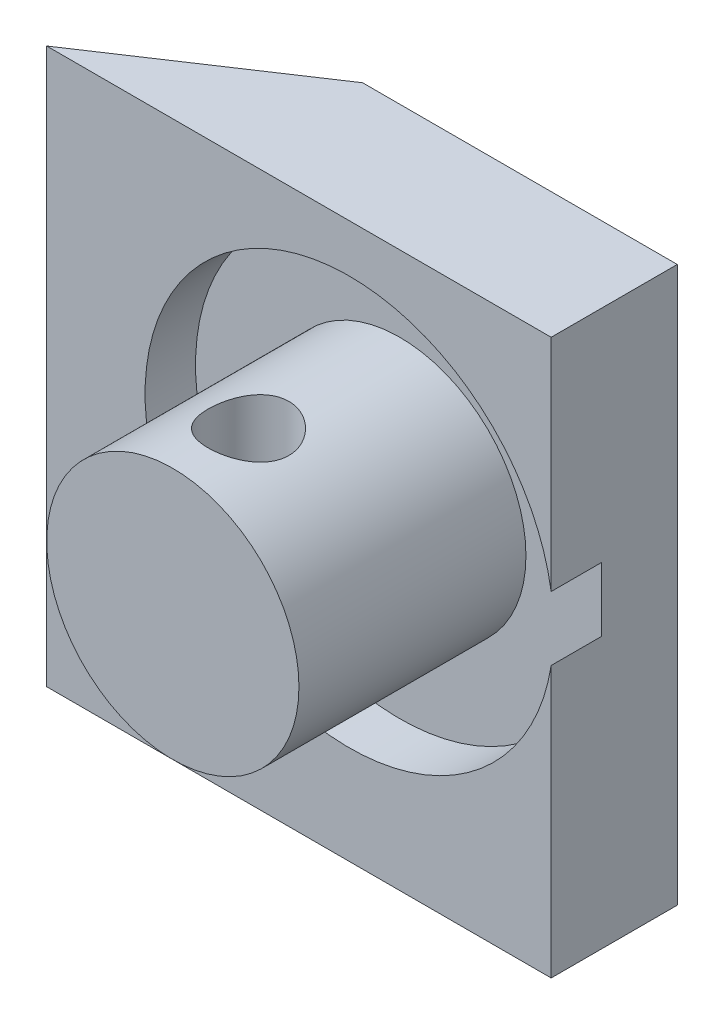
ISO-10303-21;
HEADER;
FILE_DESCRIPTION(('STEP AP214'),'2;1');
FILE_NAME('part.step','',(''),(''),'','','');
FILE_SCHEMA(('AUTOMOTIVE_DESIGN { 1 0 10303 214 1 1 1 1 }'));
ENDSEC;
DATA;
#1=APPLICATION_CONTEXT('core data for automotive mechanical design processes');
#2=APPLICATION_PROTOCOL_DEFINITION('international standard','automotive_design',2000,#1);
#3=PRODUCT_CONTEXT('',#1,'mechanical');
#4=PRODUCT('Part','Part','',(#3));
#5=PRODUCT_RELATED_PRODUCT_CATEGORY('part','',(#4));
#6=PRODUCT_DEFINITION_FORMATION('','',#4);
#7=PRODUCT_DEFINITION_CONTEXT('part definition',#1,'design');
#8=PRODUCT_DEFINITION('design','',#6,#7);
#9=PRODUCT_DEFINITION_SHAPE('','',#8);
#10=(LENGTH_UNIT() NAMED_UNIT(*) SI_UNIT(.MILLI.,.METRE.));
#11=(NAMED_UNIT(*) PLANE_ANGLE_UNIT() SI_UNIT($,.RADIAN.));
#12=(NAMED_UNIT(*) SI_UNIT($,.STERADIAN.) SOLID_ANGLE_UNIT());
#13=UNCERTAINTY_MEASURE_WITH_UNIT(LENGTH_MEASURE(1.E-05),#10,'distance_accuracy_value','');
#14=(GEOMETRIC_REPRESENTATION_CONTEXT(3) GLOBAL_UNCERTAINTY_ASSIGNED_CONTEXT((#13)) GLOBAL_UNIT_ASSIGNED_CONTEXT((#10,
#11,#12)) REPRESENTATION_CONTEXT('',''));
#15=CARTESIAN_POINT('',(0.,0.,0.));
#16=DIRECTION('',(0.,0.,1.));
#17=DIRECTION('',(1.,0.,0.));
#18=AXIS2_PLACEMENT_3D('',#15,#16,#17);
#19=CARTESIAN_POINT('',(-8.,12.,7.));
#20=DIRECTION('',(0.,0.,-1.));
#21=DIRECTION('',(-1.,0.,0.));
#22=AXIS2_PLACEMENT_3D('',#19,#20,#21);
#23=CYLINDRICAL_SURFACE('',#22,5.);
#24=CARTESIAN_POINT('',(-8.,12.,7.));
#25=DIRECTION('',(0.,0.,1.));
#26=DIRECTION('',(1.,0.,0.));
#27=AXIS2_PLACEMENT_3D('',#24,#25,#26);
#28=CIRCLE('',#27,5.);
#29=CARTESIAN_POINT('',(-3.,12.,7.));
#30=VERTEX_POINT('',#29);
#31=EDGE_CURVE('E120',#30,#30,#28,.T.);
#32=ORIENTED_EDGE('',*,*,#31,.F.);
#33=EDGE_LOOP('',(#32));
#34=FACE_BOUND('',#33,.T.);
#35=CARTESIAN_POINT('',(-8.,12.,-2.));
#36=DIRECTION('',(0.,0.,1.));
#37=DIRECTION('',(1.,0.,0.));
#38=AXIS2_PLACEMENT_3D('',#35,#36,#37);
#39=CIRCLE('',#38,5.);
#40=CARTESIAN_POINT('',(-3.,12.,-2.));
#41=VERTEX_POINT('',#40);
#42=EDGE_CURVE('E116',#41,#41,#39,.T.);
#43=ORIENTED_EDGE('',*,*,#42,.T.);
#44=EDGE_LOOP('',(#43));
#45=FACE_BOUND('',#44,.T.);
#46=CARTESIAN_POINT('',(-8.,6.99999999999999,2.4));
#47=CARTESIAN_POINT('',(-7.91250419368402,7.00000021456373,2.40000024365058));
#48=CARTESIAN_POINT('',(-7.82500536294094,7.00231815843644,2.40720059527926));
#49=CARTESIAN_POINT('',(-7.65257309876252,7.01133737827773,2.43573181952926));
#50=CARTESIAN_POINT('',(-7.56764013662629,7.01803945446441,2.45706527181791));
#51=CARTESIAN_POINT('',(-7.40285077420844,7.0350961636459,2.51306492121177));
#52=CARTESIAN_POINT('',(-7.3229865266154,7.04544497954808,2.5477098923706));
#53=CARTESIAN_POINT('',(-7.17020123714884,7.06873098357127,2.62925683008726));
#54=CARTESIAN_POINT('',(-7.09728139297505,7.08166861699614,2.67616090576561));
#55=CARTESIAN_POINT('',(-6.95810524220502,7.10922932066174,2.78248411350403));
#56=CARTESIAN_POINT('',(-6.8921039077536,7.12389042267082,2.84222709895342));
#57=CARTESIAN_POINT('',(-6.77086576306772,7.15302934296929,2.97184306654741));
#58=CARTESIAN_POINT('',(-6.71563108206203,7.16750712447671,3.04171804765487));
#59=CARTESIAN_POINT('',(-6.61608604926169,7.1950518920097,3.19185285451039));
#60=CARTESIAN_POINT('',(-6.57209876890056,7.20807214364582,3.27233628127054));
#61=CARTESIAN_POINT('',(-6.4983908286541,7.23065342201354,3.44004234377011));
#62=CARTESIAN_POINT('',(-6.46866620226674,7.24021541031984,3.52726309798831));
#63=CARTESIAN_POINT('',(-6.42526865688679,7.25439877239402,3.70308260727288));
#64=CARTESIAN_POINT('',(-6.41112103153615,7.25916585067255,3.79155210175203));
#65=CARTESIAN_POINT('',(-6.39779566941149,7.26365168955,3.96972759918446));
#66=CARTESIAN_POINT('',(-6.3986137290628,7.26337186772693,4.05943324785197));
#67=CARTESIAN_POINT('',(-6.41482619263619,7.25792380899924,4.23356558488824));
#68=CARTESIAN_POINT('',(-6.42961157867275,7.2529598256958,4.3180564534447));
#69=CARTESIAN_POINT('',(-6.47234941025861,7.23903542553838,4.48328884442206));
#70=CARTESIAN_POINT('',(-6.50030331730673,7.23007456509974,4.5640299495852));
#71=CARTESIAN_POINT('',(-6.56900354841188,7.2090134583636,4.72089785882574));
#72=CARTESIAN_POINT('',(-6.60993726896277,7.19686770530637,4.79693621995147));
#73=CARTESIAN_POINT('',(-6.70330505665932,7.17082555138832,4.94126204302677));
#74=CARTESIAN_POINT('',(-6.75574223172845,7.15692867785459,5.00954740274354));
#75=CARTESIAN_POINT('',(-6.87359448459613,7.12813627858128,5.13986467286628));
#76=CARTESIAN_POINT('',(-6.93951063750598,7.11322479191819,5.20144077693881));
#77=CARTESIAN_POINT('',(-7.08091856778285,7.08466831885122,5.31277867823365));
#78=CARTESIAN_POINT('',(-7.1564111243473,7.07102343566293,5.36253951314289));
#79=CARTESIAN_POINT('',(-7.31573841928763,7.04638210255415,5.44916344328023));
#80=CARTESIAN_POINT('',(-7.39963872055936,7.03540919452058,5.48591310083643));
#81=CARTESIAN_POINT('',(-7.57286414963887,7.01751838899803,5.54463959666271));
#82=CARTESIAN_POINT('',(-7.66218753686845,7.01059919795363,5.56662114781672));
#83=CARTESIAN_POINT('',(-7.83985821041068,7.00180575760865,5.59440006666522));
#84=CARTESIAN_POINT('',(-7.92809971398293,6.99973939821845,5.6008140736111));
#85=CARTESIAN_POINT('',(-8.10441026958811,7.00031344681555,5.5990207817787));
#86=CARTESIAN_POINT('',(-8.19247934608744,7.00295312995793,5.59081573469012));
#87=CARTESIAN_POINT('',(-8.36353501820381,7.01251619682503,5.56050988691883));
#88=CARTESIAN_POINT('',(-8.44659436247802,7.01932513350734,5.5387800899141));
#89=CARTESIAN_POINT('',(-8.60786165460058,7.03642414004651,5.48249820060375));
#90=CARTESIAN_POINT('',(-8.68606899379412,7.04671464560453,5.44794450339782));
#91=CARTESIAN_POINT('',(-8.83759692387044,7.07004468980095,5.36602898282185));
#92=CARTESIAN_POINT('',(-8.91074562050097,7.08314673729909,5.3183674880577));
#93=CARTESIAN_POINT('',(-9.04821150300662,7.1106059175952,5.21194612701436));
#94=CARTESIAN_POINT('',(-9.11252617555398,7.12496340567921,5.1531831135417));
#95=CARTESIAN_POINT('',(-9.23328321488635,7.15407032716762,5.02332584038904));
#96=CARTESIAN_POINT('',(-9.28928579475621,7.16881115833265,4.95181973231152));
#97=CARTESIAN_POINT('',(-9.3885414199257,7.19639556889855,4.80010532554179));
#98=CARTESIAN_POINT('',(-9.43179457025642,7.20923916392861,4.71989709854595));
#99=CARTESIAN_POINT('',(-9.50407580301231,7.23143737113424,4.55315642134392));
#100=CARTESIAN_POINT('',(-9.53315066307446,7.24080343179948,4.46664586501031));
#101=CARTESIAN_POINT('',(-9.57620668246201,7.25488718300672,4.28959279018967));
#102=CARTESIAN_POINT('',(-9.59019395006567,7.25960675463266,4.19905191886401));
#103=CARTESIAN_POINT('',(-9.60222535311566,7.26366072101231,4.02112403083601));
#104=CARTESIAN_POINT('',(-9.60099388446006,7.26323980908617,3.93379098867101));
#105=CARTESIAN_POINT('',(-9.5843835514937,7.25765840906254,3.7606429945653));
#106=CARTESIAN_POINT('',(-9.56900540861121,7.25249816265368,3.67482796543897));
#107=CARTESIAN_POINT('',(-9.52503332416461,7.23819456855584,3.50851657462312));
#108=CARTESIAN_POINT('',(-9.49665627942706,7.22911672763237,3.42795680110713));
#109=CARTESIAN_POINT('',(-9.42766427484382,7.20802024405638,3.27267823959919));
#110=CARTESIAN_POINT('',(-9.38704674114626,7.1960009830008,3.1979606842373));
#111=CARTESIAN_POINT('',(-9.29279266707432,7.16976505631623,3.05319037018559));
#112=CARTESIAN_POINT('',(-9.23869308431578,7.15547880947319,2.98345173726596));
#113=CARTESIAN_POINT('',(-9.11981399792884,7.12662819152646,2.85380825417904));
#114=CARTESIAN_POINT('',(-9.05503158166823,7.11206374553304,2.79390609480135));
#115=CARTESIAN_POINT('',(-8.91391221029835,7.08368891799883,2.68354171407617));
#116=CARTESIAN_POINT('',(-8.83725135176078,7.06992248119614,2.63348104811569));
#117=CARTESIAN_POINT('',(-8.67616352992694,7.04526212302139,2.54701981190277));
#118=CARTESIAN_POINT('',(-8.59173926320816,7.03436720928706,2.51061452067921));
#119=CARTESIAN_POINT('',(-8.42366343164485,7.01731658935934,2.45475222016956));
#120=CARTESIAN_POINT('',(-8.34037676648733,7.01088098698549,2.43428154941689));
#121=CARTESIAN_POINT('',(-8.17139400107612,7.00222306458606,2.40690685709599));
#122=CARTESIAN_POINT('',(-8.0856984512614,6.99999978984387,2.39999976135453));
#123=CARTESIAN_POINT('',(-8.,6.99999999999999,2.4));
#124=B_SPLINE_CURVE_WITH_KNOTS('',3,(#46,#47,#48,#49,#50,#51,#52,#53,#54,#55,#56,#57,#58,#59,
#60,#61,#62,#63,#64,#65,#66,#67,#68,#69,#70,#71,#72,#73,#74,#75,#76,#77,#78,#79,#80,#81,#82,#83,
#84,#85,#86,#87,#88,#89,#90,#91,#92,#93,#94,#95,#96,#97,#98,#99,#100,#101,#102,#103,#104,#105,
#106,#107,#108,#109,#110,#111,#112,#113,#114,#115,#116,#117,#118,#119,#120,#121,#122,#123),
.UNSPECIFIED.,.T.,.F.,(4,2,2,2,2,2,2,2,2,2,2,2,2,2,2,2,2,2,2,2,2,2,2,2,2,2,2,2,2,2,2,2,2,2,2,2,
2,2,4),(0.,0.262172289866487,0.524392446348364,0.786196202111712,1.04804502964703,
1.31749718151567,1.58700256668426,1.86354828826627,2.14001705671955,2.40780489999506,
2.67551752794223,2.93207089351445,3.18865273918778,3.44912195934763,3.70966163813009,
3.98267284808623,4.25570628624555,4.53106471334195,4.80633522466348,5.07051010591345,
5.33464430132699,5.59183416387789,5.84905622438333,6.11273355055081,6.37648573964818,
6.6512299305306,6.92597185797942,7.19980110675104,7.47351945288796,7.73426134972847,
7.99498995042988,8.25151822881316,8.50810048600705,8.77513756675923,9.04224757485583,
9.3186628553126,9.5949824844973,9.85182740305347,10.1086141011962),.UNSPECIFIED.);
#125=CARTESIAN_POINT('',(-8.,6.99999999999999,2.4));
#126=VERTEX_POINT('',#125);
#127=EDGE_CURVE('E145',#126,#126,#124,.T.);
#128=ORIENTED_EDGE('',*,*,#127,.F.);
#129=EDGE_LOOP('',(#128));
#130=FACE_BOUND('',#129,.T.);
#131=CARTESIAN_POINT('',(-8.,17.,2.4));
#132=CARTESIAN_POINT('',(-8.08749580631598,16.9999997854363,2.40000024365058));
#133=CARTESIAN_POINT('',(-8.17499463705906,16.9976818415636,2.40720059527926));
#134=CARTESIAN_POINT('',(-8.34742690123748,16.9886626217223,2.43573181952926));
#135=CARTESIAN_POINT('',(-8.43235986337371,16.9819605455356,2.45706527181791));
#136=CARTESIAN_POINT('',(-8.59714922579156,16.9649038363541,2.51306492121177));
#137=CARTESIAN_POINT('',(-8.67701347338459,16.9545550204519,2.5477098923706));
#138=CARTESIAN_POINT('',(-8.82979876285116,16.9312690164287,2.62925683008726));
#139=CARTESIAN_POINT('',(-8.90271860702495,16.9183313830039,2.67616090576561));
#140=CARTESIAN_POINT('',(-9.04189475779498,16.8907706793383,2.78248411350403));
#141=CARTESIAN_POINT('',(-9.1078960922464,16.8761095773292,2.84222709895342));
#142=CARTESIAN_POINT('',(-9.22913423693228,16.8469706570307,2.97184306654741));
#143=CARTESIAN_POINT('',(-9.28436891793797,16.8324928755233,3.04171804765487));
#144=CARTESIAN_POINT('',(-9.38391395073831,16.8049481079903,3.19185285451038));
#145=CARTESIAN_POINT('',(-9.42790123109944,16.7919278563542,3.27233628127054));
#146=CARTESIAN_POINT('',(-9.5016091713459,16.7693465779865,3.44004234377011));
#147=CARTESIAN_POINT('',(-9.53133379773326,16.7597845896802,3.52726309798831));
#148=CARTESIAN_POINT('',(-9.57473134311321,16.745601227606,3.70308260727288));
#149=CARTESIAN_POINT('',(-9.58887896846386,16.7408341493274,3.79155210175203));
#150=CARTESIAN_POINT('',(-9.60220433058851,16.73634831045,3.96972759918446));
#151=CARTESIAN_POINT('',(-9.6013862709372,16.7366281322731,4.05943324785197));
#152=CARTESIAN_POINT('',(-9.58517380736381,16.7420761910008,4.23356558488824));
#153=CARTESIAN_POINT('',(-9.57038842132725,16.7470401743042,4.3180564534447));
#154=CARTESIAN_POINT('',(-9.52765058974139,16.7609645744616,4.48328884442206));
#155=CARTESIAN_POINT('',(-9.49969668269327,16.7699254349003,4.5640299495852));
#156=CARTESIAN_POINT('',(-9.43099645158812,16.7909865416364,4.72089785882574));
#157=CARTESIAN_POINT('',(-9.39006273103723,16.8031322946936,4.79693621995147));
#158=CARTESIAN_POINT('',(-9.29669494334068,16.8291744486117,4.94126204302677));
#159=CARTESIAN_POINT('',(-9.24425776827155,16.8430713221454,5.00954740274354));
#160=CARTESIAN_POINT('',(-9.12640551540387,16.8718637214187,5.13986467286628));
#161=CARTESIAN_POINT('',(-9.06048936249402,16.8867752080818,5.20144077693881));
#162=CARTESIAN_POINT('',(-8.91908143221715,16.9153316811488,5.31277867823365));
#163=CARTESIAN_POINT('',(-8.8435888756527,16.9289765643371,5.36253951314289));
#164=CARTESIAN_POINT('',(-8.68426158071238,16.9536178974458,5.44916344328022));
#165=CARTESIAN_POINT('',(-8.60036127944064,16.9645908054794,5.48591310083643));
#166=CARTESIAN_POINT('',(-8.42713585036113,16.982481611002,5.54463959666271));
#167=CARTESIAN_POINT('',(-8.33781246313155,16.9894008020464,5.56662114781672));
#168=CARTESIAN_POINT('',(-8.16014178958932,16.9981942423913,5.59440006666522));
#169=CARTESIAN_POINT('',(-8.07190028601707,17.0002606017815,5.6008140736111));
#170=CARTESIAN_POINT('',(-7.89558973041189,16.9996865531844,5.5990207817787));
#171=CARTESIAN_POINT('',(-7.80752065391256,16.9970468700421,5.59081573469012));
#172=CARTESIAN_POINT('',(-7.63646498179619,16.987483803175,5.56050988691883));
#173=CARTESIAN_POINT('',(-7.55340563752198,16.9806748664927,5.5387800899141));
#174=CARTESIAN_POINT('',(-7.39213834539942,16.9635758599535,5.48249820060375));
#175=CARTESIAN_POINT('',(-7.31393100620588,16.9532853543955,5.44794450339782));
#176=CARTESIAN_POINT('',(-7.16240307612956,16.9299553101991,5.36602898282185));
#177=CARTESIAN_POINT('',(-7.08925437949904,16.9168532627009,5.3183674880577));
#178=CARTESIAN_POINT('',(-6.95178849699338,16.8893940824048,5.21194612701437));
#179=CARTESIAN_POINT('',(-6.88747382444602,16.8750365943208,5.1531831135417));
#180=CARTESIAN_POINT('',(-6.76671678511365,16.8459296728324,5.02332584038904));
#181=CARTESIAN_POINT('',(-6.7107142052438,16.8311888416674,4.95181973231152));
#182=CARTESIAN_POINT('',(-6.61145858007431,16.8036044311014,4.80010532554179));
#183=CARTESIAN_POINT('',(-6.56820542974359,16.7907608360714,4.71989709854595));
#184=CARTESIAN_POINT('',(-6.49592419698769,16.7685626288658,4.55315642134392));
#185=CARTESIAN_POINT('',(-6.46684933692554,16.7591965682005,4.46664586501031));
#186=CARTESIAN_POINT('',(-6.42379331753799,16.7451128169933,4.28959279018968));
#187=CARTESIAN_POINT('',(-6.40980604993433,16.7403932453673,4.19905191886402));
#188=CARTESIAN_POINT('',(-6.39777464688434,16.7363392789877,4.02112403083601));
#189=CARTESIAN_POINT('',(-6.39900611553994,16.7367601909138,3.93379098867101));
#190=CARTESIAN_POINT('',(-6.4156164485063,16.7423415909375,3.7606429945653));
#191=CARTESIAN_POINT('',(-6.43099459138879,16.7475018373463,3.67482796543897));
#192=CARTESIAN_POINT('',(-6.47496667583539,16.7618054314442,3.50851657462312));
#193=CARTESIAN_POINT('',(-6.50334372057294,16.7708832723676,3.42795680110713));
#194=CARTESIAN_POINT('',(-6.57233572515618,16.7919797559436,3.27267823959919));
#195=CARTESIAN_POINT('',(-6.61295325885374,16.8039990169992,3.1979606842373));
#196=CARTESIAN_POINT('',(-6.70720733292568,16.8302349436838,3.05319037018559));
#197=CARTESIAN_POINT('',(-6.76130691568421,16.8445211905268,2.98345173726596));
#198=CARTESIAN_POINT('',(-6.88018600207115,16.8733718084735,2.85380825417904));
#199=CARTESIAN_POINT('',(-6.94496841833177,16.887936254467,2.79390609480136));
#200=CARTESIAN_POINT('',(-7.08608778970165,16.9163110820012,2.68354171407617));
#201=CARTESIAN_POINT('',(-7.16274864823922,16.9300775188039,2.63348104811569));
#202=CARTESIAN_POINT('',(-7.32383647007306,16.9547378769786,2.54701981190277));
#203=CARTESIAN_POINT('',(-7.40826073679184,16.9656327907129,2.51061452067921));
#204=CARTESIAN_POINT('',(-7.57633656835515,16.9826834106407,2.45475222016956));
#205=CARTESIAN_POINT('',(-7.65962323351267,16.9891190130145,2.43428154941689));
#206=CARTESIAN_POINT('',(-7.82860599892388,16.9977769354139,2.40690685709599));
#207=CARTESIAN_POINT('',(-7.9143015487386,17.0000002101561,2.39999976135453));
#208=CARTESIAN_POINT('',(-8.,17.,2.4));
#209=B_SPLINE_CURVE_WITH_KNOTS('',3,(#131,#132,#133,#134,#135,#136,#137,#138,#139,#140,#141,
#142,#143,#144,#145,#146,#147,#148,#149,#150,#151,#152,#153,#154,#155,#156,#157,#158,#159,#160,
#161,#162,#163,#164,#165,#166,#167,#168,#169,#170,#171,#172,#173,#174,#175,#176,#177,#178,#179,
#180,#181,#182,#183,#184,#185,#186,#187,#188,#189,#190,#191,#192,#193,#194,#195,#196,#197,#198,
#199,#200,#201,#202,#203,#204,#205,#206,#207,#208),.UNSPECIFIED.,.T.,.F.,(4,2,2,2,2,2,2,2,2,2,2,
2,2,2,2,2,2,2,2,2,2,2,2,2,2,2,2,2,2,2,2,2,2,2,2,2,2,2,4),(0.,0.262172289866488,
0.524392446348363,0.786196202111712,1.04804502964703,1.31749718151567,1.58700256668426,
1.86354828826627,2.14001705671955,2.40780489999506,2.67551752794223,2.93207089351445,
3.18865273918778,3.44912195934763,3.70966163813009,3.98267284808623,4.25570628624555,
4.53106471334194,4.80633522466348,5.07051010591344,5.33464430132699,5.59183416387789,
5.84905622438333,6.11273355055081,6.37648573964818,6.65122993053059,6.92597185797942,
7.19980110675104,7.47351945288796,7.73426134972847,7.99498995042988,8.25151822881316,
8.50810048600704,8.77513756675922,9.04224757485583,9.3186628553126,9.5949824844973,
9.85182740305347,10.1086141011961),.UNSPECIFIED.);
#210=CARTESIAN_POINT('',(-8.,17.,2.4));
#211=VERTEX_POINT('',#210);
#212=EDGE_CURVE('E43',#211,#211,#209,.T.);
#213=ORIENTED_EDGE('',*,*,#212,.F.);
#214=EDGE_LOOP('',(#213));
#215=FACE_BOUND('',#214,.T.);
#216=ADVANCED_FACE('F39',(#34,#45,#130,#215),#23,.T.);
#217=CARTESIAN_POINT('',(0.,22.,-5.));
#218=DIRECTION('',(-1.,0.,0.));
#219=DIRECTION('',(0.,0.,1.));
#220=AXIS2_PLACEMENT_3D('',#217,#218,#219);
#221=PLANE('',#220);
#222=DIRECTION('',(0.,1.,0.));
#223=VECTOR('',#222,1.);
#224=CARTESIAN_POINT('',(0.,22.,-2.));
#225=LINE('',#224,#223);
#226=CARTESIAN_POINT('',(0.,10.731142245955,-2.));
#227=VERTEX_POINT('',#226);
#228=CARTESIAN_POINT('',(0.,13.2688577540449,-2.));
#229=VERTEX_POINT('',#228);
#230=EDGE_CURVE('E11',#227,#229,#225,.T.);
#231=ORIENTED_EDGE('',*,*,#230,.F.);
#232=DIRECTION('',(0.,0.,1.));
#233=VECTOR('',#232,1.);
#234=CARTESIAN_POINT('',(0.,10.731142245955,-2.));
#235=LINE('',#234,#233);
#236=CARTESIAN_POINT('',(0.,10.731142245955,0.));
#237=VERTEX_POINT('',#236);
#238=EDGE_CURVE('E110',#227,#237,#235,.T.);
#239=ORIENTED_EDGE('',*,*,#238,.T.);
#240=DIRECTION('',(0.,-1.,0.));
#241=VECTOR('',#240,1.);
#242=CARTESIAN_POINT('',(0.,22.,0.));
#243=LINE('',#242,#241);
#244=CARTESIAN_POINT('',(0.,0.,0.));
#245=VERTEX_POINT('',#244);
#246=EDGE_CURVE('E93',#237,#245,#243,.T.);
#247=ORIENTED_EDGE('',*,*,#246,.T.);
#248=DIRECTION('',(0.,0.,-1.));
#249=VECTOR('',#248,1.);
#250=CARTESIAN_POINT('',(0.,0.,-5.));
#251=LINE('',#250,#249);
#252=CARTESIAN_POINT('',(0.,0.,-5.));
#253=VERTEX_POINT('',#252);
#254=EDGE_CURVE('E198',#245,#253,#251,.T.);
#255=ORIENTED_EDGE('',*,*,#254,.T.);
#256=DIRECTION('',(0.,-1.,0.));
#257=VECTOR('',#256,1.);
#258=CARTESIAN_POINT('',(0.,22.,-5.));
#259=LINE('',#258,#257);
#260=CARTESIAN_POINT('',(0.,22.,-5.));
#261=VERTEX_POINT('',#260);
#262=EDGE_CURVE('E54',#261,#253,#259,.T.);
#263=ORIENTED_EDGE('',*,*,#262,.F.);
#264=DIRECTION('',(0.,0.,-1.));
#265=VECTOR('',#264,1.);
#266=CARTESIAN_POINT('',(0.,22.,-5.));
#267=LINE('',#266,#265);
#268=CARTESIAN_POINT('',(0.,22.,0.));
#269=VERTEX_POINT('',#268);
#270=EDGE_CURVE('E199',#269,#261,#267,.T.);
#271=ORIENTED_EDGE('',*,*,#270,.F.);
#272=CARTESIAN_POINT('',(0.,13.2688577540449,0.));
#273=VERTEX_POINT('',#272);
#274=EDGE_CURVE('E128',#269,#273,#243,.T.);
#275=ORIENTED_EDGE('',*,*,#274,.T.);
#276=DIRECTION('',(0.,0.,1.));
#277=VECTOR('',#276,1.);
#278=CARTESIAN_POINT('',(0.,13.2688577540449,-2.));
#279=LINE('',#278,#277);
#280=EDGE_CURVE('E62',#273,#229,#279,.F.);
#281=ORIENTED_EDGE('',*,*,#280,.T.);
#282=EDGE_LOOP('',(#231,#239,#247,#255,#263,#271,#275,#281));
#283=FACE_BOUND('',#282,.T.);
#284=ADVANCED_FACE('F41',(#283),#221,.F.);
#285=CARTESIAN_POINT('',(0.,22.,-5.));
#286=DIRECTION('',(0.,0.,1.));
#287=DIRECTION('',(1.,0.,0.));
#288=AXIS2_PLACEMENT_3D('',#285,#286,#287);
#289=PLANE('',#288);
#290=DIRECTION('',(-1.,0.,0.));
#291=VECTOR('',#290,1.);
#292=CARTESIAN_POINT('',(0.,0.,-5.));
#293=LINE('',#292,#291);
#294=CARTESIAN_POINT('',(-12.4774531024531,0.,-5.));
#295=VERTEX_POINT('',#294);
#296=EDGE_CURVE('E208',#253,#295,#293,.T.);
#297=ORIENTED_EDGE('',*,*,#296,.T.);
#298=DIRECTION('',(0.,-1.,0.));
#299=VECTOR('',#298,1.);
#300=CARTESIAN_POINT('',(-12.4774531024531,22.,-5.));
#301=LINE('',#300,#299);
#302=CARTESIAN_POINT('',(-12.4774531024531,22.,-5.));
#303=VERTEX_POINT('',#302);
#304=EDGE_CURVE('E140',#303,#295,#301,.T.);
#305=ORIENTED_EDGE('',*,*,#304,.F.);
#306=DIRECTION('',(-1.,0.,0.));
#307=VECTOR('',#306,1.);
#308=CARTESIAN_POINT('',(0.,22.,-5.));
#309=LINE('',#308,#307);
#310=EDGE_CURVE('E101',#261,#303,#309,.T.);
#311=ORIENTED_EDGE('',*,*,#310,.F.);
#312=ORIENTED_EDGE('',*,*,#262,.T.);
#313=EDGE_LOOP('',(#297,#305,#311,#312));
#314=FACE_BOUND('',#313,.T.);
#315=ADVANCED_FACE('F177',(#314),#289,.F.);
#316=CARTESIAN_POINT('',(-20.,22.,0.));
#317=DIRECTION('',(0.553547592419476,0.,0.832817544799941));
#318=DIRECTION('',(0.832817544799941,0.,-0.553547592419476));
#319=AXIS2_PLACEMENT_3D('',#316,#317,#318);
#320=PLANE('',#319);
#321=DIRECTION('',(-0.832817544799941,0.,0.553547592419476));
#322=VECTOR('',#321,1.);
#323=CARTESIAN_POINT('',(-20.,0.,0.));
#324=LINE('',#323,#322);
#325=CARTESIAN_POINT('',(-20.,0.,0.));
#326=VERTEX_POINT('',#325);
#327=EDGE_CURVE('E210',#295,#326,#324,.T.);
#328=ORIENTED_EDGE('',*,*,#327,.T.);
#329=DIRECTION('',(0.,-1.,0.));
#330=VECTOR('',#329,1.);
#331=CARTESIAN_POINT('',(-20.,22.,0.));
#332=LINE('',#331,#330);
#333=CARTESIAN_POINT('',(-20.,22.,0.));
#334=VERTEX_POINT('',#333);
#335=EDGE_CURVE('E132',#334,#326,#332,.T.);
#336=ORIENTED_EDGE('',*,*,#335,.F.);
#337=DIRECTION('',(-0.832817544799941,0.,0.553547592419476));
#338=VECTOR('',#337,1.);
#339=CARTESIAN_POINT('',(-20.,22.,0.));
#340=LINE('',#339,#338);
#341=EDGE_CURVE('E133',#303,#334,#340,.T.);
#342=ORIENTED_EDGE('',*,*,#341,.F.);
#343=ORIENTED_EDGE('',*,*,#304,.T.);
#344=EDGE_LOOP('',(#328,#336,#342,#343));
#345=FACE_BOUND('',#344,.T.);
#346=ADVANCED_FACE('F216',(#345),#320,.F.);
#347=CARTESIAN_POINT('',(0.,22.,0.));
#348=DIRECTION('',(0.,0.,-1.));
#349=DIRECTION('',(-1.,0.,0.));
#350=AXIS2_PLACEMENT_3D('',#347,#348,#349);
#351=PLANE('',#350);
#352=ORIENTED_EDGE('',*,*,#246,.F.);
#353=CARTESIAN_POINT('',(-8.,12.,0.));
#354=DIRECTION('',(0.,0.,1.));
#355=DIRECTION('',(1.,0.,0.));
#356=AXIS2_PLACEMENT_3D('',#353,#354,#355);
#357=CIRCLE('',#356,8.1);
#358=EDGE_CURVE('E108',#273,#237,#357,.T.);
#359=ORIENTED_EDGE('',*,*,#358,.F.);
#360=ORIENTED_EDGE('',*,*,#274,.F.);
#361=DIRECTION('',(1.,0.,0.));
#362=VECTOR('',#361,1.);
#363=CARTESIAN_POINT('',(0.,22.,0.));
#364=LINE('',#363,#362);
#365=EDGE_CURVE('E71',#334,#269,#364,.T.);
#366=ORIENTED_EDGE('',*,*,#365,.F.);
#367=ORIENTED_EDGE('',*,*,#335,.T.);
#368=DIRECTION('',(1.,0.,0.));
#369=VECTOR('',#368,1.);
#370=CARTESIAN_POINT('',(0.,0.,0.));
#371=LINE('',#370,#369);
#372=EDGE_CURVE('E125',#326,#245,#371,.T.);
#373=ORIENTED_EDGE('',*,*,#372,.T.);
#374=EDGE_LOOP('',(#352,#359,#360,#366,#367,#373));
#375=FACE_BOUND('',#374,.T.);
#376=ADVANCED_FACE('F122',(#375),#351,.F.);
#377=CARTESIAN_POINT('',(0.,22.,0.));
#378=DIRECTION('',(0.,-1.,0.));
#379=DIRECTION('',(0.,0.,-1.));
#380=AXIS2_PLACEMENT_3D('',#377,#378,#379);
#381=PLANE('',#380);
#382=ORIENTED_EDGE('',*,*,#270,.T.);
#383=ORIENTED_EDGE('',*,*,#310,.T.);
#384=ORIENTED_EDGE('',*,*,#341,.T.);
#385=ORIENTED_EDGE('',*,*,#365,.T.);
#386=EDGE_LOOP('',(#382,#383,#384,#385));
#387=FACE_BOUND('',#386,.T.);
#388=ADVANCED_FACE('F221',(#387),#381,.F.);
#389=CARTESIAN_POINT('',(0.,0.,0.));
#390=DIRECTION('',(0.,-1.,0.));
#391=DIRECTION('',(0.,0.,-1.));
#392=AXIS2_PLACEMENT_3D('',#389,#390,#391);
#393=PLANE('',#392);
#394=ORIENTED_EDGE('',*,*,#254,.F.);
#395=ORIENTED_EDGE('',*,*,#372,.F.);
#396=ORIENTED_EDGE('',*,*,#327,.F.);
#397=ORIENTED_EDGE('',*,*,#296,.F.);
#398=EDGE_LOOP('',(#394,#395,#396,#397));
#399=FACE_BOUND('',#398,.T.);
#400=ADVANCED_FACE('F164',(#399),#393,.T.);
#401=CARTESIAN_POINT('',(-8.,12.,-2.));
#402=DIRECTION('',(0.,0.,1.));
#403=DIRECTION('',(1.,0.,0.));
#404=AXIS2_PLACEMENT_3D('',#401,#402,#403);
#405=PLANE('',#404);
#406=ORIENTED_EDGE('',*,*,#42,.F.);
#407=EDGE_LOOP('',(#406));
#408=FACE_BOUND('',#407,.T.);
#409=ORIENTED_EDGE('',*,*,#230,.T.);
#410=CARTESIAN_POINT('',(-8.,12.,-2.));
#411=DIRECTION('',(0.,0.,1.));
#412=DIRECTION('',(1.,0.,0.));
#413=AXIS2_PLACEMENT_3D('',#410,#411,#412);
#414=CIRCLE('',#413,8.1);
#415=EDGE_CURVE('E115',#229,#227,#414,.T.);
#416=ORIENTED_EDGE('',*,*,#415,.T.);
#417=EDGE_LOOP('',(#409,#416));
#418=FACE_BOUND('',#417,.T.);
#419=ADVANCED_FACE('F160',(#408,#418),#405,.T.);
#420=CARTESIAN_POINT('',(-8.,12.,-2.));
#421=DIRECTION('',(0.,0.,1.));
#422=DIRECTION('',(1.,0.,0.));
#423=AXIS2_PLACEMENT_3D('',#420,#421,#422);
#424=CYLINDRICAL_SURFACE('',#423,8.1);
#425=ORIENTED_EDGE('',*,*,#415,.F.);
#426=ORIENTED_EDGE('',*,*,#280,.F.);
#427=ORIENTED_EDGE('',*,*,#358,.T.);
#428=ORIENTED_EDGE('',*,*,#238,.F.);
#429=EDGE_LOOP('',(#425,#426,#427,#428));
#430=FACE_BOUND('',#429,.T.);
#431=ADVANCED_FACE('F109',(#430),#424,.F.);
#432=CARTESIAN_POINT('',(-8.,12.,7.));
#433=DIRECTION('',(0.,0.,1.));
#434=DIRECTION('',(1.,0.,0.));
#435=AXIS2_PLACEMENT_3D('',#432,#433,#434);
#436=PLANE('',#435);
#437=ORIENTED_EDGE('',*,*,#31,.T.);
#438=EDGE_LOOP('',(#437));
#439=FACE_BOUND('',#438,.T.);
#440=ADVANCED_FACE('F158',(#439),#436,.T.);
#441=CARTESIAN_POINT('',(-8.,22.,4.));
#442=DIRECTION('',(0.,-1.,0.));
#443=DIRECTION('',(0.,0.,-1.));
#444=AXIS2_PLACEMENT_3D('',#441,#442,#443);
#445=CYLINDRICAL_SURFACE('',#444,1.6);
#446=ORIENTED_EDGE('',*,*,#127,.T.);
#447=EDGE_LOOP('',(#446));
#448=FACE_BOUND('',#447,.T.);
#449=ORIENTED_EDGE('',*,*,#212,.T.);
#450=EDGE_LOOP('',(#449));
#451=FACE_BOUND('',#450,.T.);
#452=ADVANCED_FACE('F154',(#448,#451),#445,.F.);
#453=CLOSED_SHELL('',(#216,#284,#315,#346,#376,#388,#400,#419,#431,#440,#452));
#454=MANIFOLD_SOLID_BREP('B2',#453);
#455=ADVANCED_BREP_SHAPE_REPRESENTATION('',(#18,#454),#14);
#456=SHAPE_DEFINITION_REPRESENTATION(#9,#455);
ENDSEC;
END-ISO-10303-21;
